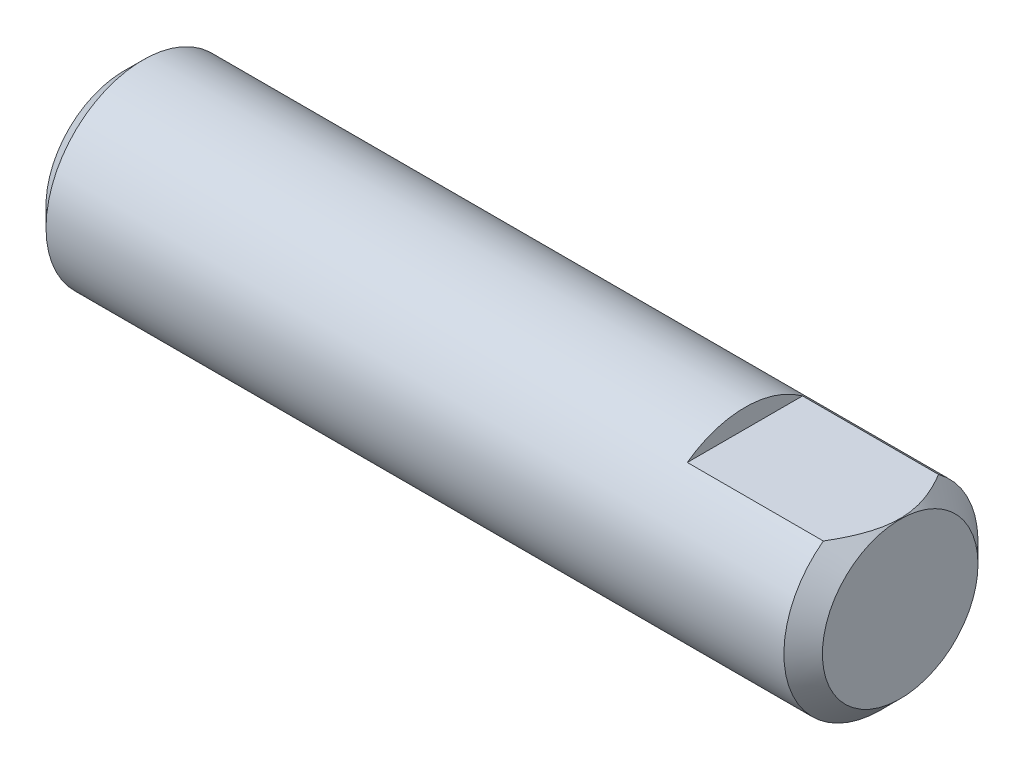
ISO-10303-21;
HEADER;
FILE_DESCRIPTION(('STEP AP214'),'2;1');
FILE_NAME('part.step','',(''),(''),'','','');
FILE_SCHEMA(('AUTOMOTIVE_DESIGN { 1 0 10303 214 1 1 1 1 }'));
ENDSEC;
DATA;
#1=APPLICATION_CONTEXT('core data for automotive mechanical design processes');
#2=APPLICATION_PROTOCOL_DEFINITION('international standard','automotive_design',2000,#1);
#3=PRODUCT_CONTEXT('',#1,'mechanical');
#4=PRODUCT('Part','Part','',(#3));
#5=PRODUCT_RELATED_PRODUCT_CATEGORY('part','',(#4));
#6=PRODUCT_DEFINITION_FORMATION('','',#4);
#7=PRODUCT_DEFINITION_CONTEXT('part definition',#1,'design');
#8=PRODUCT_DEFINITION('design','',#6,#7);
#9=PRODUCT_DEFINITION_SHAPE('','',#8);
#10=(LENGTH_UNIT() NAMED_UNIT(*) SI_UNIT(.MILLI.,.METRE.));
#11=(NAMED_UNIT(*) PLANE_ANGLE_UNIT() SI_UNIT($,.RADIAN.));
#12=(NAMED_UNIT(*) SI_UNIT($,.STERADIAN.) SOLID_ANGLE_UNIT());
#13=UNCERTAINTY_MEASURE_WITH_UNIT(LENGTH_MEASURE(1.E-05),#10,'distance_accuracy_value','');
#14=(GEOMETRIC_REPRESENTATION_CONTEXT(3) GLOBAL_UNCERTAINTY_ASSIGNED_CONTEXT((#13)) GLOBAL_UNIT_ASSIGNED_CONTEXT((#10,
#11,#12)) REPRESENTATION_CONTEXT('',''));
#15=CARTESIAN_POINT('',(0.,0.,0.));
#16=DIRECTION('',(0.,0.,1.));
#17=DIRECTION('',(1.,0.,0.));
#18=AXIS2_PLACEMENT_3D('',#15,#16,#17);
#19=CARTESIAN_POINT('',(31.75,0.,0.));
#20=DIRECTION('',(-1.,0.,0.));
#21=DIRECTION('',(0.,0.,1.));
#22=AXIS2_PLACEMENT_3D('',#19,#20,#21);
#23=CYLINDRICAL_SURFACE('',#22,3.96875);
#24=CARTESIAN_POINT('',(30.9626,0.,0.));
#25=DIRECTION('',(1.,0.,0.));
#26=DIRECTION('',(0.,0.,-1.));
#27=AXIS2_PLACEMENT_3D('',#24,#25,#26);
#28=CIRCLE('',#27,3.96875);
#29=CARTESIAN_POINT('',(30.9626,3.19404999999999,-2.35563604149708));
#30=VERTEX_POINT('',#29);
#31=CARTESIAN_POINT('',(30.9626,3.19404999999999,2.35563604149708));
#32=VERTEX_POINT('',#31);
#33=EDGE_CURVE('E71',#30,#32,#28,.F.);
#34=ORIENTED_EDGE('',*,*,#33,.T.);
#35=DIRECTION('',(-1.,0.,0.));
#36=VECTOR('',#35,1.);
#37=CARTESIAN_POINT('',(31.75,3.19404999999999,2.35563604149708));
#38=LINE('',#37,#36);
#39=CARTESIAN_POINT('',(25.4,3.19404999999999,2.35563604149708));
#40=VERTEX_POINT('',#39);
#41=EDGE_CURVE('E51',#32,#40,#38,.T.);
#42=ORIENTED_EDGE('',*,*,#41,.T.);
#43=CARTESIAN_POINT('',(25.4,0.,0.));
#44=DIRECTION('',(1.,0.,0.));
#45=DIRECTION('',(0.,0.,-1.));
#46=AXIS2_PLACEMENT_3D('',#43,#44,#45);
#47=CIRCLE('',#46,3.96875);
#48=CARTESIAN_POINT('',(25.4,3.19404999999999,-2.35563604149708));
#49=VERTEX_POINT('',#48);
#50=EDGE_CURVE('E12',#49,#40,#47,.T.);
#51=ORIENTED_EDGE('',*,*,#50,.F.);
#52=DIRECTION('',(-1.,0.,0.));
#53=VECTOR('',#52,1.);
#54=CARTESIAN_POINT('',(31.75,3.19404999999999,-2.35563604149708));
#55=LINE('',#54,#53);
#56=EDGE_CURVE('E66',#49,#30,#55,.F.);
#57=ORIENTED_EDGE('',*,*,#56,.T.);
#58=EDGE_LOOP('',(#34,#42,#51,#57));
#59=FACE_BOUND('',#58,.T.);
#60=CARTESIAN_POINT('',(0.787399999999994,0.,0.));
#61=DIRECTION('',(1.,0.,0.));
#62=DIRECTION('',(0.,0.,-1.));
#63=AXIS2_PLACEMENT_3D('',#60,#61,#62);
#64=CIRCLE('',#63,3.96875);
#65=CARTESIAN_POINT('',(0.787399999999994,0.,-3.96875));
#66=VERTEX_POINT('',#65);
#67=EDGE_CURVE('E73',#66,#66,#64,.T.);
#68=ORIENTED_EDGE('',*,*,#67,.T.);
#69=EDGE_LOOP('',(#68));
#70=FACE_BOUND('',#69,.T.);
#71=ADVANCED_FACE('F35',(#59,#70),#23,.T.);
#72=CARTESIAN_POINT('',(31.75,0.,0.));
#73=DIRECTION('',(1.,0.,0.));
#74=DIRECTION('',(0.,0.,-1.));
#75=AXIS2_PLACEMENT_3D('',#72,#73,#74);
#76=PLANE('',#75);
#77=CARTESIAN_POINT('',(31.75,0.,0.));
#78=DIRECTION('',(1.,0.,0.));
#79=DIRECTION('',(0.,0.,-1.));
#80=AXIS2_PLACEMENT_3D('',#77,#78,#79);
#81=CIRCLE('',#80,3.18135);
#82=CARTESIAN_POINT('',(31.75,0.,-3.18135000000001));
#83=VERTEX_POINT('',#82);
#84=EDGE_CURVE('E82',#83,#83,#81,.T.);
#85=ORIENTED_EDGE('',*,*,#84,.T.);
#86=EDGE_LOOP('',(#85));
#87=FACE_BOUND('',#86,.T.);
#88=ADVANCED_FACE('F92',(#87),#76,.T.);
#89=CARTESIAN_POINT('',(0.,0.,0.));
#90=DIRECTION('',(1.,0.,0.));
#91=DIRECTION('',(0.,0.,-1.));
#92=AXIS2_PLACEMENT_3D('',#89,#90,#91);
#93=PLANE('',#92);
#94=CARTESIAN_POINT('',(0.,0.,0.));
#95=DIRECTION('',(1.,0.,0.));
#96=DIRECTION('',(0.,0.,-1.));
#97=AXIS2_PLACEMENT_3D('',#94,#95,#96);
#98=CIRCLE('',#97,3.18135);
#99=CARTESIAN_POINT('',(0.,0.,-3.18135));
#100=VERTEX_POINT('',#99);
#101=EDGE_CURVE('E79',#100,#100,#98,.F.);
#102=ORIENTED_EDGE('',*,*,#101,.T.);
#103=EDGE_LOOP('',(#102));
#104=FACE_BOUND('',#103,.T.);
#105=ADVANCED_FACE('F95',(#104),#93,.F.);
#106=CARTESIAN_POINT('',(0.787399999999994,0.,0.));
#107=DIRECTION('',(1.,0.,0.));
#108=DIRECTION('',(0.,0.,-1.));
#109=AXIS2_PLACEMENT_3D('',#106,#107,#108);
#110=CONICAL_SURFACE('',#109,3.96875,0.785398163397453);
#111=ORIENTED_EDGE('',*,*,#101,.F.);
#112=EDGE_LOOP('',(#111));
#113=FACE_BOUND('',#112,.T.);
#114=ORIENTED_EDGE('',*,*,#67,.F.);
#115=EDGE_LOOP('',(#114));
#116=FACE_BOUND('',#115,.T.);
#117=ADVANCED_FACE('F99',(#113,#116),#110,.T.);
#118=CARTESIAN_POINT('',(31.75,0.,0.));
#119=DIRECTION('',(-1.,0.,0.));
#120=DIRECTION('',(0.,0.,1.));
#121=AXIS2_PLACEMENT_3D('',#118,#119,#120);
#122=CONICAL_SURFACE('',#121,3.18135,0.785398163397446);
#123=CARTESIAN_POINT('',(27.8769082418328,3.19405,-6.28992791030816));
#124=CARTESIAN_POINT('',(28.0059924747644,3.19404999999999,-6.14513192451955));
#125=CARTESIAN_POINT('',(28.1345906697042,3.19404999999999,-5.99989856264123));
#126=CARTESIAN_POINT('',(28.3905558259617,3.19404999999999,-5.70832555098703));
#127=CARTESIAN_POINT('',(28.5179226615974,3.19404999999999,-5.56198579094422));
#128=CARTESIAN_POINT('',(28.7716615030383,3.19404999999999,-5.26739185425325));
#129=CARTESIAN_POINT('',(28.8980272461925,3.19404999999999,-5.11913227355343));
#130=CARTESIAN_POINT('',(29.1488325021588,3.19404999999999,-4.82100149032346));
#131=CARTESIAN_POINT('',(29.2732721030488,3.19404999999999,-4.67113036201997));
#132=CARTESIAN_POINT('',(29.5270728644846,3.19404999999999,-4.36036484721676));
#133=CARTESIAN_POINT('',(29.6562834574633,3.19404999999999,-4.19934712902049));
#134=CARTESIAN_POINT('',(29.9110673350526,3.19404999999999,-3.87446199044452));
#135=CARTESIAN_POINT('',(30.0366408396075,3.19404999999999,-3.71059474334647));
#136=CARTESIAN_POINT('',(30.2826531453908,3.19404999999999,-3.3794529821139));
#137=CARTESIAN_POINT('',(30.4031000927706,3.19404999999999,-3.21218454928704));
#138=CARTESIAN_POINT('',(30.6371080926254,3.19404999999999,-2.87292351934765));
#139=CARTESIAN_POINT('',(30.7506714822848,3.19404999999999,-2.70093255482964));
#140=CARTESIAN_POINT('',(30.9361534114331,3.19404999999999,-2.40188566537678));
#141=CARTESIAN_POINT('',(31.0105490744306,3.19404999999999,-2.27637403004283));
#142=CARTESIAN_POINT('',(31.1527791031719,3.19404999999999,-2.02159117361759));
#143=CARTESIAN_POINT('',(31.2206113160057,3.19404999999999,-1.89231873689051));
#144=CARTESIAN_POINT('',(31.3469516445883,3.19404999999999,-1.63063511110503));
#145=CARTESIAN_POINT('',(31.4055359725237,3.19404999999999,-1.49826116398757));
#146=CARTESIAN_POINT('',(31.511245642474,3.19404999999999,-1.22900132118919));
#147=CARTESIAN_POINT('',(31.5583788132713,3.19404999999999,-1.09211858113828));
#148=CARTESIAN_POINT('',(31.6247388770547,3.19404999999999,-0.860043432696467));
#149=CARTESIAN_POINT('',(31.6480408252195,3.19404999999999,-0.766018114014804));
#150=CARTESIAN_POINT('',(31.6870343045274,3.19404999999999,-0.576391972521273));
#151=CARTESIAN_POINT('',(31.702727144332,3.19404999999999,-0.480791423553698));
#152=CARTESIAN_POINT('',(31.725668224944,3.19404999999999,-0.28891931932001));
#153=CARTESIAN_POINT('',(31.7329468341482,3.19404999999999,-0.192651446636189));
#154=CARTESIAN_POINT('',(31.7387534530674,3.19404999999999,0.000152826274964107));
#155=CARTESIAN_POINT('',(31.7372814594932,3.19404999999999,0.0966892266032156));
#156=CARTESIAN_POINT('',(31.7256999137029,3.19404999999999,0.288767732669009));
#157=CARTESIAN_POINT('',(31.7156319033531,3.19404999999999,0.38431238719116));
#158=CARTESIAN_POINT('',(31.687455627757,3.19404999999999,0.574213377937743));
#159=CARTESIAN_POINT('',(31.6693454597839,3.19404999999999,0.668569427509219));
#160=CARTESIAN_POINT('',(31.625695650103,3.19404999999999,0.856659379719357));
#161=CARTESIAN_POINT('',(31.6000737021593,3.19404999999999,0.95037394166411));
#162=CARTESIAN_POINT('',(31.5425120962417,3.19404999999999,1.13579797835558));
#163=CARTESIAN_POINT('',(31.5105735953258,3.19404999999999,1.22750781691328));
#164=CARTESIAN_POINT('',(31.4301564317588,3.19404999999999,1.43831133104687));
#165=CARTESIAN_POINT('',(31.3796732572314,3.19404999999999,1.55663676809052));
#166=CARTESIAN_POINT('',(31.2714161903604,3.19404999999999,1.7899294062943));
#167=CARTESIAN_POINT('',(31.2136383268383,3.19404999999999,1.9048947359337));
#168=CARTESIAN_POINT('',(31.0922143454242,3.19404999999999,2.13219828157281));
#169=CARTESIAN_POINT('',(31.0285476023336,3.19404999999999,2.24452539237101));
#170=CARTESIAN_POINT('',(30.8967936471575,3.19404999999999,2.46650871131348));
#171=CARTESIAN_POINT('',(30.8287072869973,3.19404999999999,2.57616542863179));
#172=CARTESIAN_POINT('',(30.6925194656392,3.19404999999999,2.78782299886053));
#173=CARTESIAN_POINT('',(30.6245872639273,3.19404999999999,2.88993332848826));
#174=CARTESIAN_POINT('',(30.4861771139404,3.19404999999999,3.09242034921377));
#175=CARTESIAN_POINT('',(30.4156989621249,3.19404999999999,3.19279690074906));
#176=CARTESIAN_POINT('',(30.2733085312255,3.19404999999999,3.39118462998334));
#177=CARTESIAN_POINT('',(30.2014143739944,3.19404999999999,3.48920885956507));
#178=CARTESIAN_POINT('',(30.0559568072355,3.19404999999999,3.68397175598666));
#179=CARTESIAN_POINT('',(29.9823938462241,3.19405,3.78071075742301));
#180=CARTESIAN_POINT('',(29.9081567946212,3.19405,3.87692075958013));
#181=B_SPLINE_CURVE_WITH_KNOTS('',3,(#123,#124,#125,#126,#127,#128,#129,#130,#131,#132,#133,
#134,#135,#136,#137,#138,#139,#140,#141,#142,#143,#144,#145,#146,#147,#148,#149,#150,#151,#152,
#153,#154,#155,#156,#157,#158,#159,#160,#161,#162,#163,#164,#165,#166,#167,#168,#169,#170,#171,
#172,#173,#174,#175,#176,#177,#178,#179,#180),.UNSPECIFIED.,.F.,.F.,(4,2,2,2,2,2,2,2,2,2,2,2,2,
2,2,2,2,2,2,2,2,2,2,2,2,2,2,2,4),(0.,0.58194634798939,1.1639514797865,1.74835503537946,
2.33273178811753,2.95204698604945,3.57132465383076,4.1895784450357,4.80762113001856,
5.24518774026616,5.68289739577972,6.1167867865684,6.55037870130742,6.84072175420207,
7.13101485437906,7.42025693346913,7.70949912127821,7.99735135288247,8.28527172493081,
8.57647290513397,8.86762079279921,9.25322101999871,9.63903207783529,10.0262496329748,
10.413392768435,10.7812760909818,11.1491888900021,11.5138580469152,11.8784303281917),.UNSPECIFIED.);
#182=EDGE_CURVE('E44',#32,#30,#181,.F.);
#183=ORIENTED_EDGE('',*,*,#182,.F.);
#184=ORIENTED_EDGE('',*,*,#33,.F.);
#185=EDGE_LOOP('',(#183,#184));
#186=FACE_BOUND('',#185,.T.);
#187=ORIENTED_EDGE('',*,*,#84,.F.);
#188=EDGE_LOOP('',(#187));
#189=FACE_BOUND('',#188,.T.);
#190=ADVANCED_FACE('F37',(#186,#189),#122,.T.);
#191=CARTESIAN_POINT('',(25.4,3.19404999999999,3.81000000000001));
#192=DIRECTION('',(1.,0.,0.));
#193=DIRECTION('',(0.,0.,-1.));
#194=AXIS2_PLACEMENT_3D('',#191,#192,#193);
#195=PLANE('',#194);
#196=ORIENTED_EDGE('',*,*,#50,.T.);
#197=DIRECTION('',(0.,0.,-1.));
#198=VECTOR('',#197,1.);
#199=CARTESIAN_POINT('',(25.4,3.19404999999999,3.81000000000001));
#200=LINE('',#199,#198);
#201=EDGE_CURVE('E63',#40,#49,#200,.T.);
#202=ORIENTED_EDGE('',*,*,#201,.T.);
#203=EDGE_LOOP('',(#196,#202));
#204=FACE_BOUND('',#203,.T.);
#205=ADVANCED_FACE('F62',(#204),#195,.T.);
#206=CARTESIAN_POINT('',(25.4,3.19404999999999,3.81000000000001));
#207=DIRECTION('',(0.,-1.,0.));
#208=DIRECTION('',(0.,0.,-1.));
#209=AXIS2_PLACEMENT_3D('',#206,#207,#208);
#210=PLANE('',#209);
#211=ORIENTED_EDGE('',*,*,#182,.T.);
#212=ORIENTED_EDGE('',*,*,#56,.F.);
#213=ORIENTED_EDGE('',*,*,#201,.F.);
#214=ORIENTED_EDGE('',*,*,#41,.F.);
#215=EDGE_LOOP('',(#211,#212,#213,#214));
#216=FACE_BOUND('',#215,.T.);
#217=ADVANCED_FACE('F65',(#216),#210,.F.);
#218=CLOSED_SHELL('',(#71,#88,#105,#117,#190,#205,#217));
#219=MANIFOLD_SOLID_BREP('B2',#218);
#220=ADVANCED_BREP_SHAPE_REPRESENTATION('',(#18,#219),#14);
#221=SHAPE_DEFINITION_REPRESENTATION(#9,#220);
ENDSEC;
END-ISO-10303-21;
